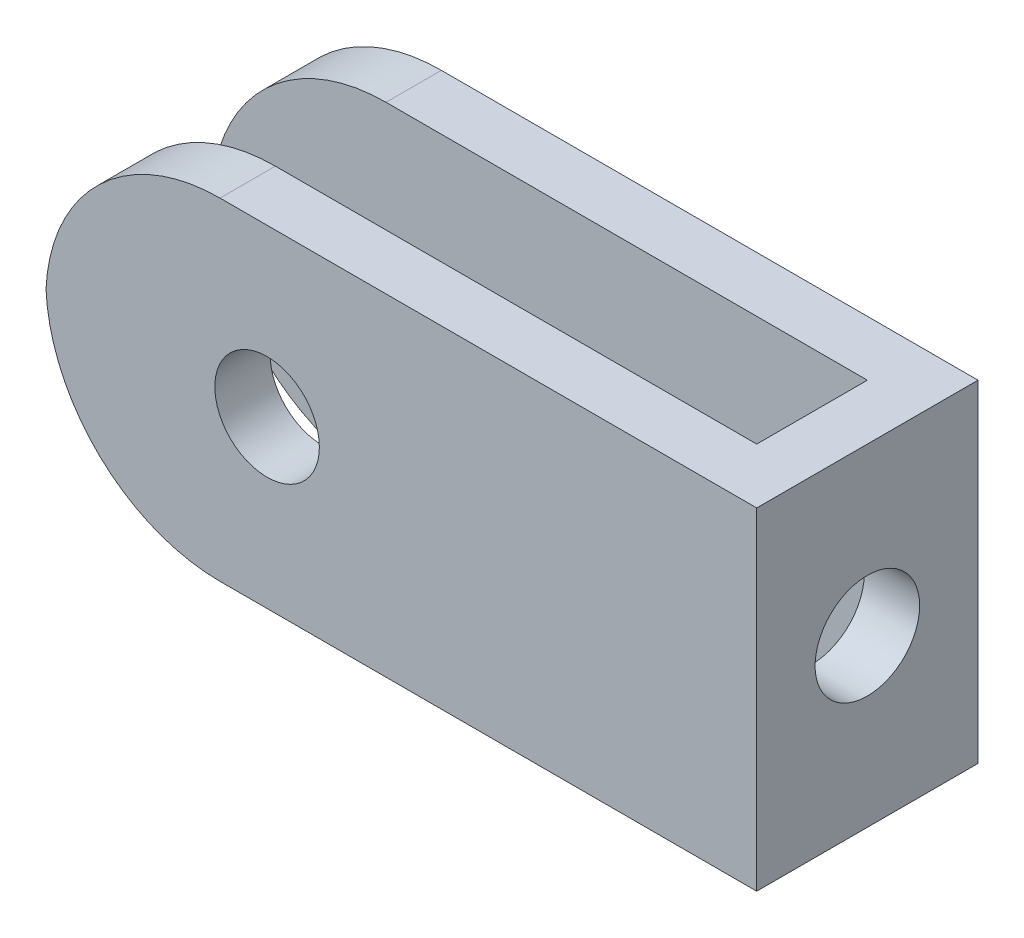
ISO-10303-21;
HEADER;
FILE_DESCRIPTION(('STEP AP214'),'2;1');
FILE_NAME('part.step','',(''),(''),'','','');
FILE_SCHEMA(('AUTOMOTIVE_DESIGN { 1 0 10303 214 1 1 1 1 }'));
ENDSEC;
DATA;
#1=APPLICATION_CONTEXT('core data for automotive mechanical design processes');
#2=APPLICATION_PROTOCOL_DEFINITION('international standard','automotive_design',2000,#1);
#3=PRODUCT_CONTEXT('',#1,'mechanical');
#4=PRODUCT('Part','Part','',(#3));
#5=PRODUCT_RELATED_PRODUCT_CATEGORY('part','',(#4));
#6=PRODUCT_DEFINITION_FORMATION('','',#4);
#7=PRODUCT_DEFINITION_CONTEXT('part definition',#1,'design');
#8=PRODUCT_DEFINITION('design','',#6,#7);
#9=PRODUCT_DEFINITION_SHAPE('','',#8);
#10=(LENGTH_UNIT() NAMED_UNIT(*) SI_UNIT(.MILLI.,.METRE.));
#11=(NAMED_UNIT(*) PLANE_ANGLE_UNIT() SI_UNIT($,.RADIAN.));
#12=(NAMED_UNIT(*) SI_UNIT($,.STERADIAN.) SOLID_ANGLE_UNIT());
#13=UNCERTAINTY_MEASURE_WITH_UNIT(LENGTH_MEASURE(1.E-05),#10,'distance_accuracy_value','');
#14=(GEOMETRIC_REPRESENTATION_CONTEXT(3) GLOBAL_UNCERTAINTY_ASSIGNED_CONTEXT((#13)) GLOBAL_UNIT_ASSIGNED_CONTEXT((#10,
#11,#12)) REPRESENTATION_CONTEXT('',''));
#15=CARTESIAN_POINT('',(0.,0.,0.));
#16=DIRECTION('',(0.,0.,1.));
#17=DIRECTION('',(1.,0.,0.));
#18=AXIS2_PLACEMENT_3D('',#15,#16,#17);
#19=CARTESIAN_POINT('',(0.,19.05,0.));
#20=DIRECTION('',(0.,0.,-1.));
#21=DIRECTION('',(-1.,0.,0.));
#22=AXIS2_PLACEMENT_3D('',#19,#20,#21);
#23=PLANE('',#22);
#24=CARTESIAN_POINT('',(12.7,9.525,0.));
#25=DIRECTION('',(0.,0.,-1.));
#26=DIRECTION('',(-1.,0.,0.));
#27=AXIS2_PLACEMENT_3D('',#24,#25,#26);
#28=CIRCLE('',#27,3.);
#29=CARTESIAN_POINT('',(15.7,9.525,0.));
#30=VERTEX_POINT('',#29);
#31=EDGE_CURVE('E391',#30,#30,#28,.T.);
#32=ORIENTED_EDGE('',*,*,#31,.T.);
#33=EDGE_LOOP('',(#32));
#34=FACE_BOUND('',#33,.T.);
#35=CARTESIAN_POINT('',(10.,9.05,0.));
#36=DIRECTION('',(0.,0.,-1.));
#37=DIRECTION('',(-1.,0.,0.));
#38=AXIS2_PLACEMENT_3D('',#35,#36,#37);
#39=CIRCLE('',#38,10.);
#40=CARTESIAN_POINT('',(10.,19.05,0.));
#41=VERTEX_POINT('',#40);
#42=CARTESIAN_POINT('',(0.0112876205188468,9.525,0.));
#43=VERTEX_POINT('',#42);
#44=EDGE_CURVE('E134',#41,#43,#39,.F.);
#45=ORIENTED_EDGE('',*,*,#44,.T.);
#46=CARTESIAN_POINT('',(10.,10.,0.));
#47=DIRECTION('',(0.,0.,-1.));
#48=DIRECTION('',(-1.,0.,0.));
#49=AXIS2_PLACEMENT_3D('',#46,#47,#48);
#50=CIRCLE('',#49,10.);
#51=CARTESIAN_POINT('',(10.,0.,0.));
#52=VERTEX_POINT('',#51);
#53=EDGE_CURVE('E171',#43,#52,#50,.F.);
#54=ORIENTED_EDGE('',*,*,#53,.T.);
#55=DIRECTION('',(1.,0.,0.));
#56=VECTOR('',#55,1.);
#57=CARTESIAN_POINT('',(0.,0.,0.));
#58=LINE('',#57,#56);
#59=CARTESIAN_POINT('',(37.625,0.,0.));
#60=VERTEX_POINT('',#59);
#61=EDGE_CURVE('E131',#52,#60,#58,.T.);
#62=ORIENTED_EDGE('',*,*,#61,.T.);
#63=DIRECTION('',(0.,-1.,0.));
#64=VECTOR('',#63,1.);
#65=CARTESIAN_POINT('',(37.625,19.05,0.));
#66=LINE('',#65,#64);
#67=CARTESIAN_POINT('',(37.625,19.05,0.));
#68=VERTEX_POINT('',#67);
#69=EDGE_CURVE('E129',#68,#60,#66,.T.);
#70=ORIENTED_EDGE('',*,*,#69,.F.);
#71=DIRECTION('',(1.,0.,0.));
#72=VECTOR('',#71,1.);
#73=CARTESIAN_POINT('',(0.,19.05,0.));
#74=LINE('',#73,#72);
#75=EDGE_CURVE('E114',#41,#68,#74,.T.);
#76=ORIENTED_EDGE('',*,*,#75,.F.);
#77=EDGE_LOOP('',(#45,#54,#62,#70,#76));
#78=FACE_BOUND('',#77,.T.);
#79=ADVANCED_FACE('F37',(#34,#78),#23,.F.);
#80=CARTESIAN_POINT('',(37.625,19.05,0.));
#81=DIRECTION('',(1.,0.,0.));
#82=DIRECTION('',(0.,0.,-1.));
#83=AXIS2_PLACEMENT_3D('',#80,#81,#82);
#84=PLANE('',#83);
#85=CARTESIAN_POINT('',(37.625,9.525,3.175));
#86=DIRECTION('',(1.,0.,0.));
#87=DIRECTION('',(0.,0.,-1.));
#88=AXIS2_PLACEMENT_3D('',#85,#86,#87);
#89=CIRCLE('',#88,3.);
#90=CARTESIAN_POINT('',(37.625,9.525,0.175000000000001));
#91=VERTEX_POINT('',#90);
#92=EDGE_CURVE('E154',#91,#91,#89,.F.);
#93=ORIENTED_EDGE('',*,*,#92,.F.);
#94=EDGE_LOOP('',(#93));
#95=FACE_BOUND('',#94,.T.);
#96=DIRECTION('',(0.,0.,1.));
#97=VECTOR('',#96,1.);
#98=CARTESIAN_POINT('',(37.625,0.,0.));
#99=LINE('',#98,#97);
#100=CARTESIAN_POINT('',(37.625,0.,6.35));
#101=VERTEX_POINT('',#100);
#102=EDGE_CURVE('E153',#60,#101,#99,.T.);
#103=ORIENTED_EDGE('',*,*,#102,.T.);
#104=DIRECTION('',(0.,-1.,0.));
#105=VECTOR('',#104,1.);
#106=CARTESIAN_POINT('',(37.625,19.05,6.35));
#107=LINE('',#106,#105);
#108=CARTESIAN_POINT('',(37.625,19.05,6.35));
#109=VERTEX_POINT('',#108);
#110=EDGE_CURVE('E135',#109,#101,#107,.T.);
#111=ORIENTED_EDGE('',*,*,#110,.F.);
#112=DIRECTION('',(0.,0.,1.));
#113=VECTOR('',#112,1.);
#114=CARTESIAN_POINT('',(37.625,19.05,0.));
#115=LINE('',#114,#113);
#116=EDGE_CURVE('E120',#68,#109,#115,.T.);
#117=ORIENTED_EDGE('',*,*,#116,.F.);
#118=ORIENTED_EDGE('',*,*,#69,.T.);
#119=EDGE_LOOP('',(#103,#111,#117,#118));
#120=FACE_BOUND('',#119,.T.);
#121=ADVANCED_FACE('F137',(#95,#120),#84,.F.);
#122=CARTESIAN_POINT('',(37.625,19.05,6.35));
#123=DIRECTION('',(0.,0.,1.));
#124=DIRECTION('',(1.,0.,0.));
#125=AXIS2_PLACEMENT_3D('',#122,#123,#124);
#126=PLANE('',#125);
#127=CARTESIAN_POINT('',(12.7,9.525,6.35));
#128=DIRECTION('',(0.,0.,1.));
#129=DIRECTION('',(1.,0.,0.));
#130=AXIS2_PLACEMENT_3D('',#127,#128,#129);
#131=CIRCLE('',#130,3.);
#132=CARTESIAN_POINT('',(15.7,9.525,6.35));
#133=VERTEX_POINT('',#132);
#134=EDGE_CURVE('E389',#133,#133,#131,.T.);
#135=ORIENTED_EDGE('',*,*,#134,.T.);
#136=EDGE_LOOP('',(#135));
#137=FACE_BOUND('',#136,.T.);
#138=DIRECTION('',(-1.,0.,0.));
#139=VECTOR('',#138,1.);
#140=CARTESIAN_POINT('',(37.625,0.,6.35));
#141=LINE('',#140,#139);
#142=CARTESIAN_POINT('',(10.,0.,6.35));
#143=VERTEX_POINT('',#142);
#144=EDGE_CURVE('E156',#101,#143,#141,.T.);
#145=ORIENTED_EDGE('',*,*,#144,.T.);
#146=CARTESIAN_POINT('',(10.,10.,6.35));
#147=DIRECTION('',(0.,0.,1.));
#148=DIRECTION('',(1.,0.,0.));
#149=AXIS2_PLACEMENT_3D('',#146,#147,#148);
#150=CIRCLE('',#149,10.);
#151=CARTESIAN_POINT('',(0.0112876205188468,9.525,6.35));
#152=VERTEX_POINT('',#151);
#153=EDGE_CURVE('E11',#143,#152,#150,.F.);
#154=ORIENTED_EDGE('',*,*,#153,.T.);
#155=CARTESIAN_POINT('',(10.,9.05,6.35));
#156=DIRECTION('',(0.,0.,1.));
#157=DIRECTION('',(1.,0.,0.));
#158=AXIS2_PLACEMENT_3D('',#155,#156,#157);
#159=CIRCLE('',#158,10.);
#160=CARTESIAN_POINT('',(10.,19.05,6.35));
#161=VERTEX_POINT('',#160);
#162=EDGE_CURVE('E46',#152,#161,#159,.F.);
#163=ORIENTED_EDGE('',*,*,#162,.T.);
#164=DIRECTION('',(-1.,0.,0.));
#165=VECTOR('',#164,1.);
#166=CARTESIAN_POINT('',(37.625,19.05,6.35));
#167=LINE('',#166,#165);
#168=EDGE_CURVE('E140',#109,#161,#167,.T.);
#169=ORIENTED_EDGE('',*,*,#168,.F.);
#170=ORIENTED_EDGE('',*,*,#110,.T.);
#171=EDGE_LOOP('',(#145,#154,#163,#169,#170));
#172=FACE_BOUND('',#171,.T.);
#173=ADVANCED_FACE('F205',(#137,#172),#126,.F.);
#174=CARTESIAN_POINT('',(40.8,19.05,9.525));
#175=DIRECTION('',(0.,0.,-1.));
#176=DIRECTION('',(-1.,0.,0.));
#177=AXIS2_PLACEMENT_3D('',#174,#175,#176);
#178=PLANE('',#177);
#179=CARTESIAN_POINT('',(12.7,9.525,9.52500000000001));
#180=DIRECTION('',(0.,0.,1.));
#181=DIRECTION('',(1.,0.,0.));
#182=AXIS2_PLACEMENT_3D('',#179,#180,#181);
#183=CIRCLE('',#182,3.);
#184=CARTESIAN_POINT('',(15.7,9.525,9.52500000000001));
#185=VERTEX_POINT('',#184);
#186=EDGE_CURVE('E191',#185,#185,#183,.T.);
#187=ORIENTED_EDGE('',*,*,#186,.F.);
#188=EDGE_LOOP('',(#187));
#189=FACE_BOUND('',#188,.T.);
#190=CARTESIAN_POINT('',(10.,9.05,9.525));
#191=DIRECTION('',(0.,0.,-1.));
#192=DIRECTION('',(-1.,0.,0.));
#193=AXIS2_PLACEMENT_3D('',#190,#191,#192);
#194=CIRCLE('',#193,10.);
#195=CARTESIAN_POINT('',(10.,19.05,9.525));
#196=VERTEX_POINT('',#195);
#197=CARTESIAN_POINT('',(0.0112876205188486,9.52499999999998,9.52500000000001));
#198=VERTEX_POINT('',#197);
#199=EDGE_CURVE('E60',#196,#198,#194,.F.);
#200=ORIENTED_EDGE('',*,*,#199,.T.);
#201=CARTESIAN_POINT('',(10.,10.,9.525));
#202=DIRECTION('',(0.,0.,-1.));
#203=DIRECTION('',(-1.,0.,0.));
#204=AXIS2_PLACEMENT_3D('',#201,#202,#203);
#205=CIRCLE('',#204,10.);
#206=CARTESIAN_POINT('',(10.,0.,9.525));
#207=VERTEX_POINT('',#206);
#208=EDGE_CURVE('E187',#198,#207,#205,.F.);
#209=ORIENTED_EDGE('',*,*,#208,.T.);
#210=DIRECTION('',(1.,0.,0.));
#211=VECTOR('',#210,1.);
#212=CARTESIAN_POINT('',(40.8,0.,9.525));
#213=LINE('',#212,#211);
#214=CARTESIAN_POINT('',(40.8,0.,9.525));
#215=VERTEX_POINT('',#214);
#216=EDGE_CURVE('E158',#207,#215,#213,.T.);
#217=ORIENTED_EDGE('',*,*,#216,.T.);
#218=DIRECTION('',(0.,-1.,0.));
#219=VECTOR('',#218,1.);
#220=CARTESIAN_POINT('',(40.8,19.05,9.525));
#221=LINE('',#220,#219);
#222=CARTESIAN_POINT('',(40.8,19.05,9.525));
#223=VERTEX_POINT('',#222);
#224=EDGE_CURVE('E166',#223,#215,#221,.T.);
#225=ORIENTED_EDGE('',*,*,#224,.F.);
#226=DIRECTION('',(1.,0.,0.));
#227=VECTOR('',#226,1.);
#228=CARTESIAN_POINT('',(40.8,19.05,9.525));
#229=LINE('',#228,#227);
#230=EDGE_CURVE('E142',#196,#223,#229,.T.);
#231=ORIENTED_EDGE('',*,*,#230,.F.);
#232=EDGE_LOOP('',(#200,#209,#217,#225,#231));
#233=FACE_BOUND('',#232,.T.);
#234=ADVANCED_FACE('F207',(#189,#233),#178,.F.);
#235=CARTESIAN_POINT('',(40.8,19.05,-3.175));
#236=DIRECTION('',(-1.,0.,0.));
#237=DIRECTION('',(0.,0.,1.));
#238=AXIS2_PLACEMENT_3D('',#235,#236,#237);
#239=PLANE('',#238);
#240=CARTESIAN_POINT('',(40.8,9.525,3.175));
#241=DIRECTION('',(1.,0.,0.));
#242=DIRECTION('',(0.,0.,-1.));
#243=AXIS2_PLACEMENT_3D('',#240,#241,#242);
#244=CIRCLE('',#243,3.);
#245=CARTESIAN_POINT('',(40.8,9.525,0.175));
#246=VERTEX_POINT('',#245);
#247=EDGE_CURVE('E393',#246,#246,#244,.T.);
#248=ORIENTED_EDGE('',*,*,#247,.F.);
#249=EDGE_LOOP('',(#248));
#250=FACE_BOUND('',#249,.T.);
#251=DIRECTION('',(0.,0.,-1.));
#252=VECTOR('',#251,1.);
#253=CARTESIAN_POINT('',(40.8,0.,-3.175));
#254=LINE('',#253,#252);
#255=CARTESIAN_POINT('',(40.8,0.,-3.175));
#256=VERTEX_POINT('',#255);
#257=EDGE_CURVE('E160',#215,#256,#254,.T.);
#258=ORIENTED_EDGE('',*,*,#257,.T.);
#259=DIRECTION('',(0.,-1.,0.));
#260=VECTOR('',#259,1.);
#261=CARTESIAN_POINT('',(40.8,19.05,-3.175));
#262=LINE('',#261,#260);
#263=CARTESIAN_POINT('',(40.8,19.05,-3.175));
#264=VERTEX_POINT('',#263);
#265=EDGE_CURVE('E151',#264,#256,#262,.T.);
#266=ORIENTED_EDGE('',*,*,#265,.F.);
#267=DIRECTION('',(0.,0.,-1.));
#268=VECTOR('',#267,1.);
#269=CARTESIAN_POINT('',(40.8,19.05,-3.175));
#270=LINE('',#269,#268);
#271=EDGE_CURVE('E147',#223,#264,#270,.T.);
#272=ORIENTED_EDGE('',*,*,#271,.F.);
#273=ORIENTED_EDGE('',*,*,#224,.T.);
#274=EDGE_LOOP('',(#258,#266,#272,#273));
#275=FACE_BOUND('',#274,.T.);
#276=ADVANCED_FACE('F213',(#250,#275),#239,.F.);
#277=CARTESIAN_POINT('',(0.,19.05,-3.175));
#278=DIRECTION('',(0.,0.,1.));
#279=DIRECTION('',(1.,0.,0.));
#280=AXIS2_PLACEMENT_3D('',#277,#278,#279);
#281=PLANE('',#280);
#282=CARTESIAN_POINT('',(12.7,9.525,-3.175));
#283=DIRECTION('',(0.,0.,1.));
#284=DIRECTION('',(1.,0.,0.));
#285=AXIS2_PLACEMENT_3D('',#282,#283,#284);
#286=CIRCLE('',#285,3.);
#287=CARTESIAN_POINT('',(15.7,9.525,-3.175));
#288=VERTEX_POINT('',#287);
#289=EDGE_CURVE('E196',#288,#288,#286,.F.);
#290=ORIENTED_EDGE('',*,*,#289,.F.);
#291=EDGE_LOOP('',(#290));
#292=FACE_BOUND('',#291,.T.);
#293=DIRECTION('',(-1.,0.,0.));
#294=VECTOR('',#293,1.);
#295=CARTESIAN_POINT('',(0.,0.,-3.175));
#296=LINE('',#295,#294);
#297=CARTESIAN_POINT('',(10.,0.,-3.175));
#298=VERTEX_POINT('',#297);
#299=EDGE_CURVE('E126',#256,#298,#296,.T.);
#300=ORIENTED_EDGE('',*,*,#299,.T.);
#301=CARTESIAN_POINT('',(10.,10.,-3.175));
#302=DIRECTION('',(0.,0.,1.));
#303=DIRECTION('',(1.,0.,0.));
#304=AXIS2_PLACEMENT_3D('',#301,#302,#303);
#305=CIRCLE('',#304,10.);
#306=CARTESIAN_POINT('',(0.0112876205188468,9.525,-3.175));
#307=VERTEX_POINT('',#306);
#308=EDGE_CURVE('E181',#298,#307,#305,.F.);
#309=ORIENTED_EDGE('',*,*,#308,.T.);
#310=CARTESIAN_POINT('',(10.,9.05,-3.175));
#311=DIRECTION('',(0.,0.,1.));
#312=DIRECTION('',(1.,0.,0.));
#313=AXIS2_PLACEMENT_3D('',#310,#311,#312);
#314=CIRCLE('',#313,10.);
#315=CARTESIAN_POINT('',(10.,19.05,-3.175));
#316=VERTEX_POINT('',#315);
#317=EDGE_CURVE('E179',#307,#316,#314,.F.);
#318=ORIENTED_EDGE('',*,*,#317,.T.);
#319=DIRECTION('',(-1.,0.,0.));
#320=VECTOR('',#319,1.);
#321=CARTESIAN_POINT('',(0.,19.05,-3.175));
#322=LINE('',#321,#320);
#323=EDGE_CURVE('E149',#264,#316,#322,.T.);
#324=ORIENTED_EDGE('',*,*,#323,.F.);
#325=ORIENTED_EDGE('',*,*,#265,.T.);
#326=EDGE_LOOP('',(#300,#309,#318,#324,#325));
#327=FACE_BOUND('',#326,.T.);
#328=ADVANCED_FACE('F225',(#292,#327),#281,.F.);
#329=CARTESIAN_POINT('',(0.,19.05,0.));
#330=DIRECTION('',(0.,1.,0.));
#331=DIRECTION('',(0.,0.,1.));
#332=AXIS2_PLACEMENT_3D('',#329,#330,#331);
#333=PLANE('',#332);
#334=ORIENTED_EDGE('',*,*,#323,.T.);
#335=DIRECTION('',(0.,0.,1.));
#336=VECTOR('',#335,1.);
#337=CARTESIAN_POINT('',(10.,19.05,0.));
#338=LINE('',#337,#336);
#339=EDGE_CURVE('E123',#316,#41,#338,.T.);
#340=ORIENTED_EDGE('',*,*,#339,.T.);
#341=ORIENTED_EDGE('',*,*,#75,.T.);
#342=ORIENTED_EDGE('',*,*,#116,.T.);
#343=ORIENTED_EDGE('',*,*,#168,.T.);
#344=DIRECTION('',(0.,0.,1.));
#345=VECTOR('',#344,1.);
#346=CARTESIAN_POINT('',(10.,19.05,9.525));
#347=LINE('',#346,#345);
#348=EDGE_CURVE('E183',#161,#196,#347,.T.);
#349=ORIENTED_EDGE('',*,*,#348,.T.);
#350=ORIENTED_EDGE('',*,*,#230,.T.);
#351=ORIENTED_EDGE('',*,*,#271,.T.);
#352=EDGE_LOOP('',(#334,#340,#341,#342,#343,#349,#350,#351));
#353=FACE_BOUND('',#352,.T.);
#354=ADVANCED_FACE('F117',(#353),#333,.T.);
#355=CARTESIAN_POINT('',(0.,0.,0.));
#356=DIRECTION('',(0.,1.,0.));
#357=DIRECTION('',(0.,0.,1.));
#358=AXIS2_PLACEMENT_3D('',#355,#356,#357);
#359=PLANE('',#358);
#360=ORIENTED_EDGE('',*,*,#61,.F.);
#361=DIRECTION('',(0.,0.,1.));
#362=VECTOR('',#361,1.);
#363=CARTESIAN_POINT('',(10.,0.,0.));
#364=LINE('',#363,#362);
#365=EDGE_CURVE('E176',#52,#298,#364,.F.);
#366=ORIENTED_EDGE('',*,*,#365,.T.);
#367=ORIENTED_EDGE('',*,*,#299,.F.);
#368=ORIENTED_EDGE('',*,*,#257,.F.);
#369=ORIENTED_EDGE('',*,*,#216,.F.);
#370=DIRECTION('',(0.,0.,1.));
#371=VECTOR('',#370,1.);
#372=CARTESIAN_POINT('',(10.,0.,0.));
#373=LINE('',#372,#371);
#374=EDGE_CURVE('E173',#207,#143,#373,.F.);
#375=ORIENTED_EDGE('',*,*,#374,.T.);
#376=ORIENTED_EDGE('',*,*,#144,.F.);
#377=ORIENTED_EDGE('',*,*,#102,.F.);
#378=EDGE_LOOP('',(#360,#366,#367,#368,#369,#375,#376,#377));
#379=FACE_BOUND('',#378,.T.);
#380=ADVANCED_FACE('F221',(#379),#359,.F.);
#381=CARTESIAN_POINT('',(29.1397186257614,9.525,3.175));
#382=DIRECTION('',(1.,0.,0.));
#383=DIRECTION('',(0.,0.,-1.));
#384=AXIS2_PLACEMENT_3D('',#381,#382,#383);
#385=CYLINDRICAL_SURFACE('',#384,3.);
#386=ORIENTED_EDGE('',*,*,#92,.T.);
#387=EDGE_LOOP('',(#386));
#388=FACE_BOUND('',#387,.T.);
#389=ORIENTED_EDGE('',*,*,#247,.T.);
#390=EDGE_LOOP('',(#389));
#391=FACE_BOUND('',#390,.T.);
#392=ADVANCED_FACE('F282',(#388,#391),#385,.F.);
#393=CARTESIAN_POINT('',(12.7,9.525,-11.6602813742386));
#394=DIRECTION('',(0.,0.,1.));
#395=DIRECTION('',(1.,0.,0.));
#396=AXIS2_PLACEMENT_3D('',#393,#394,#395);
#397=CYLINDRICAL_SURFACE('',#396,3.);
#398=CARTESIAN_POINT('',(15.7,9.525,-3.175));
#399=CARTESIAN_POINT('',(15.7,9.525,-3.14192708333333));
#400=CARTESIAN_POINT('',(15.7,9.525,-3.10885416666667));
#401=CARTESIAN_POINT('',(15.7,9.525,-3.04270833333333));
#402=CARTESIAN_POINT('',(15.7,9.525,-3.00963541666667));
#403=CARTESIAN_POINT('',(15.7,9.525,-2.94348958333333));
#404=CARTESIAN_POINT('',(15.7,9.525,-2.91041666666667));
#405=CARTESIAN_POINT('',(15.7,9.525,-2.84427083333333));
#406=CARTESIAN_POINT('',(15.7,9.525,-2.81119791666667));
#407=CARTESIAN_POINT('',(15.7,9.525,-2.74505208333333));
#408=CARTESIAN_POINT('',(15.7,9.525,-2.71197916666667));
#409=CARTESIAN_POINT('',(15.7,9.525,-2.64583333333333));
#410=CARTESIAN_POINT('',(15.7,9.525,-2.61276041666667));
#411=CARTESIAN_POINT('',(15.7,9.525,-2.54661458333333));
#412=CARTESIAN_POINT('',(15.7,9.525,-2.51354166666667));
#413=CARTESIAN_POINT('',(15.7,9.525,-2.44739583333333));
#414=CARTESIAN_POINT('',(15.7,9.525,-2.41432291666667));
#415=CARTESIAN_POINT('',(15.7,9.525,-2.34817708333333));
#416=CARTESIAN_POINT('',(15.7,9.525,-2.31510416666667));
#417=CARTESIAN_POINT('',(15.7,9.525,-2.24895833333333));
#418=CARTESIAN_POINT('',(15.7,9.525,-2.21588541666667));
#419=CARTESIAN_POINT('',(15.7,9.525,-2.14973958333333));
#420=CARTESIAN_POINT('',(15.7,9.525,-2.11666666666667));
#421=CARTESIAN_POINT('',(15.7,9.525,-2.05052083333333));
#422=CARTESIAN_POINT('',(15.7,9.525,-2.01744791666667));
#423=CARTESIAN_POINT('',(15.7,9.525,-1.95130208333333));
#424=CARTESIAN_POINT('',(15.7,9.525,-1.91822916666667));
#425=CARTESIAN_POINT('',(15.7,9.525,-1.85208333333333));
#426=CARTESIAN_POINT('',(15.7,9.525,-1.81901041666667));
#427=CARTESIAN_POINT('',(15.7,9.525,-1.75286458333333));
#428=CARTESIAN_POINT('',(15.7,9.525,-1.71979166666667));
#429=CARTESIAN_POINT('',(15.7,9.525,-1.65364583333333));
#430=CARTESIAN_POINT('',(15.7,9.525,-1.62057291666667));
#431=CARTESIAN_POINT('',(15.7,9.525,-1.55442708333333));
#432=CARTESIAN_POINT('',(15.7,9.525,-1.52135416666667));
#433=CARTESIAN_POINT('',(15.7,9.525,-1.45520833333333));
#434=CARTESIAN_POINT('',(15.7,9.525,-1.42213541666667));
#435=CARTESIAN_POINT('',(15.7,9.525,-1.35598958333333));
#436=CARTESIAN_POINT('',(15.7,9.525,-1.32291666666667));
#437=CARTESIAN_POINT('',(15.7,9.525,-1.25677083333333));
#438=CARTESIAN_POINT('',(15.7,9.525,-1.22369791666667));
#439=CARTESIAN_POINT('',(15.7,9.525,-1.15755208333333));
#440=CARTESIAN_POINT('',(15.7,9.525,-1.12447916666667));
#441=CARTESIAN_POINT('',(15.7,9.525,-1.05833333333333));
#442=CARTESIAN_POINT('',(15.7,9.525,-1.02526041666667));
#443=CARTESIAN_POINT('',(15.7,9.525,-0.959114583333334));
#444=CARTESIAN_POINT('',(15.7,9.525,-0.926041666666667));
#445=CARTESIAN_POINT('',(15.7,9.525,-0.859895833333334));
#446=CARTESIAN_POINT('',(15.7,9.525,-0.826822916666666));
#447=CARTESIAN_POINT('',(15.7,9.525,-0.760677083333333));
#448=CARTESIAN_POINT('',(15.7,9.525,-0.727604166666666));
#449=CARTESIAN_POINT('',(15.7,9.525,-0.661458333333333));
#450=CARTESIAN_POINT('',(15.7,9.525,-0.628385416666667));
#451=CARTESIAN_POINT('',(15.7,9.525,-0.562239583333333));
#452=CARTESIAN_POINT('',(15.7,9.525,-0.529166666666666));
#453=CARTESIAN_POINT('',(15.7,9.525,-0.463020833333333));
#454=CARTESIAN_POINT('',(15.7,9.525,-0.429947916666666));
#455=CARTESIAN_POINT('',(15.7,9.525,-0.363802083333333));
#456=CARTESIAN_POINT('',(15.7,9.525,-0.330729166666667));
#457=CARTESIAN_POINT('',(15.7,9.525,-0.264583333333333));
#458=CARTESIAN_POINT('',(15.7,9.525,-0.231510416666666));
#459=CARTESIAN_POINT('',(15.7,9.525,-0.165364583333332));
#460=CARTESIAN_POINT('',(15.7,9.525,-0.132291666666666));
#461=CARTESIAN_POINT('',(15.7,9.525,-0.066145833333333));
#462=CARTESIAN_POINT('',(15.7,9.525,-0.0330729166666665));
#463=CARTESIAN_POINT('',(15.7,9.525,0.));
#464=B_SPLINE_CURVE_WITH_KNOTS('',3,(#398,#399,#400,#401,#402,#403,#404,#405,#406,#407,#408,
#409,#410,#411,#412,#413,#414,#415,#416,#417,#418,#419,#420,#421,#422,#423,#424,#425,#426,#427,
#428,#429,#430,#431,#432,#433,#434,#435,#436,#437,#438,#439,#440,#441,#442,#443,#444,#445,#446,
#447,#448,#449,#450,#451,#452,#453,#454,#455,#456,#457,#458,#459,#460,#461,#462,#463),
.UNSPECIFIED.,.F.,.F.,(4,2,2,2,2,2,2,2,2,2,2,2,2,2,2,2,2,2,2,2,2,2,2,2,2,2,2,2,2,2,2,2,4),(0.,
0.0992187499999995,0.198437500000001,0.29765625,0.396875,0.496093750000001,0.5953125,0.69453125,
0.793749999999999,0.892968750000001,0.9921875,1.09140625,1.190625,1.28984375,1.3890625,
1.48828125,1.5875,1.68671875,1.7859375,1.88515625,1.984375,2.08359375,2.1828125,2.28203125,
2.38125,2.48046875,2.5796875,2.67890625,2.778125,2.87734375,2.9765625,3.07578125,3.175),.UNSPECIFIED.);
#465=EDGE_CURVE('BSEAM274',#288,#30,#464,.T.);
#466=ORIENTED_EDGE('',*,*,#289,.T.);
#467=ORIENTED_EDGE('',*,*,#31,.F.);
#468=ORIENTED_EDGE('',*,*,#465,.T.);
#469=ORIENTED_EDGE('',*,*,#465,.F.);
#470=EDGE_LOOP('',(#466,#468,#467,#469));
#471=FACE_BOUND('',#470,.T.);
#472=ADVANCED_FACE('F274',(#471),#397,.F.);
#473=ORIENTED_EDGE('',*,*,#186,.T.);
#474=EDGE_LOOP('',(#473));
#475=FACE_BOUND('',#474,.T.);
#476=ORIENTED_EDGE('',*,*,#134,.F.);
#477=EDGE_LOOP('',(#476));
#478=FACE_BOUND('',#477,.T.);
#479=ADVANCED_FACE('F252',(#475,#478),#397,.F.);
#480=CARTESIAN_POINT('',(10.,9.05,0.));
#481=DIRECTION('',(0.,0.,-1.));
#482=DIRECTION('',(-1.,0.,0.));
#483=AXIS2_PLACEMENT_3D('',#480,#481,#482);
#484=CYLINDRICAL_SURFACE('',#483,10.);
#485=ORIENTED_EDGE('',*,*,#339,.F.);
#486=ORIENTED_EDGE('',*,*,#317,.F.);
#487=DIRECTION('',(0.,0.,-1.));
#488=VECTOR('',#487,1.);
#489=CARTESIAN_POINT('',(0.0112876205188468,9.525,-1.5875));
#490=LINE('',#489,#488);
#491=EDGE_CURVE('E189',#43,#307,#490,.T.);
#492=ORIENTED_EDGE('',*,*,#491,.F.);
#493=ORIENTED_EDGE('',*,*,#44,.F.);
#494=EDGE_LOOP('',(#485,#486,#492,#493));
#495=FACE_BOUND('',#494,.T.);
#496=ADVANCED_FACE('F218',(#495),#484,.T.);
#497=CARTESIAN_POINT('',(10.,10.,-3.175));
#498=DIRECTION('',(0.,0.,1.));
#499=DIRECTION('',(1.,0.,0.));
#500=AXIS2_PLACEMENT_3D('',#497,#498,#499);
#501=CYLINDRICAL_SURFACE('',#500,10.);
#502=ORIENTED_EDGE('',*,*,#308,.F.);
#503=ORIENTED_EDGE('',*,*,#365,.F.);
#504=ORIENTED_EDGE('',*,*,#53,.F.);
#505=ORIENTED_EDGE('',*,*,#491,.T.);
#506=EDGE_LOOP('',(#502,#503,#504,#505));
#507=FACE_BOUND('',#506,.T.);
#508=ADVANCED_FACE('F224',(#507),#501,.T.);
#509=CARTESIAN_POINT('',(10.,9.05,0.));
#510=DIRECTION('',(0.,0.,-1.));
#511=DIRECTION('',(-1.,0.,0.));
#512=AXIS2_PLACEMENT_3D('',#509,#510,#511);
#513=CYLINDRICAL_SURFACE('',#512,10.);
#514=ORIENTED_EDGE('',*,*,#348,.F.);
#515=ORIENTED_EDGE('',*,*,#162,.F.);
#516=DIRECTION('',(0.,0.,-1.));
#517=VECTOR('',#516,1.);
#518=CARTESIAN_POINT('',(0.0112876205188486,9.52499999999998,7.93750000000001));
#519=LINE('',#518,#517);
#520=EDGE_CURVE('E41',#198,#152,#519,.T.);
#521=ORIENTED_EDGE('',*,*,#520,.F.);
#522=ORIENTED_EDGE('',*,*,#199,.F.);
#523=EDGE_LOOP('',(#514,#515,#521,#522));
#524=FACE_BOUND('',#523,.T.);
#525=ADVANCED_FACE('F39',(#524),#513,.T.);
#526=CARTESIAN_POINT('',(10.,10.,6.35));
#527=DIRECTION('',(0.,0.,1.));
#528=DIRECTION('',(1.,0.,0.));
#529=AXIS2_PLACEMENT_3D('',#526,#527,#528);
#530=CYLINDRICAL_SURFACE('',#529,10.);
#531=ORIENTED_EDGE('',*,*,#153,.F.);
#532=ORIENTED_EDGE('',*,*,#374,.F.);
#533=ORIENTED_EDGE('',*,*,#208,.F.);
#534=ORIENTED_EDGE('',*,*,#520,.T.);
#535=EDGE_LOOP('',(#531,#532,#533,#534));
#536=FACE_BOUND('',#535,.T.);
#537=ADVANCED_FACE('F201',(#536),#530,.T.);
#538=CLOSED_SHELL('',(#79,#121,#173,#234,#276,#328,#354,#380,#392,#472,#479,#496,#508,#525,#537));
#539=MANIFOLD_SOLID_BREP('B2',#538);
#540=ADVANCED_BREP_SHAPE_REPRESENTATION('',(#18,#539),#14);
#541=SHAPE_DEFINITION_REPRESENTATION(#9,#540);
ENDSEC;
END-ISO-10303-21;
